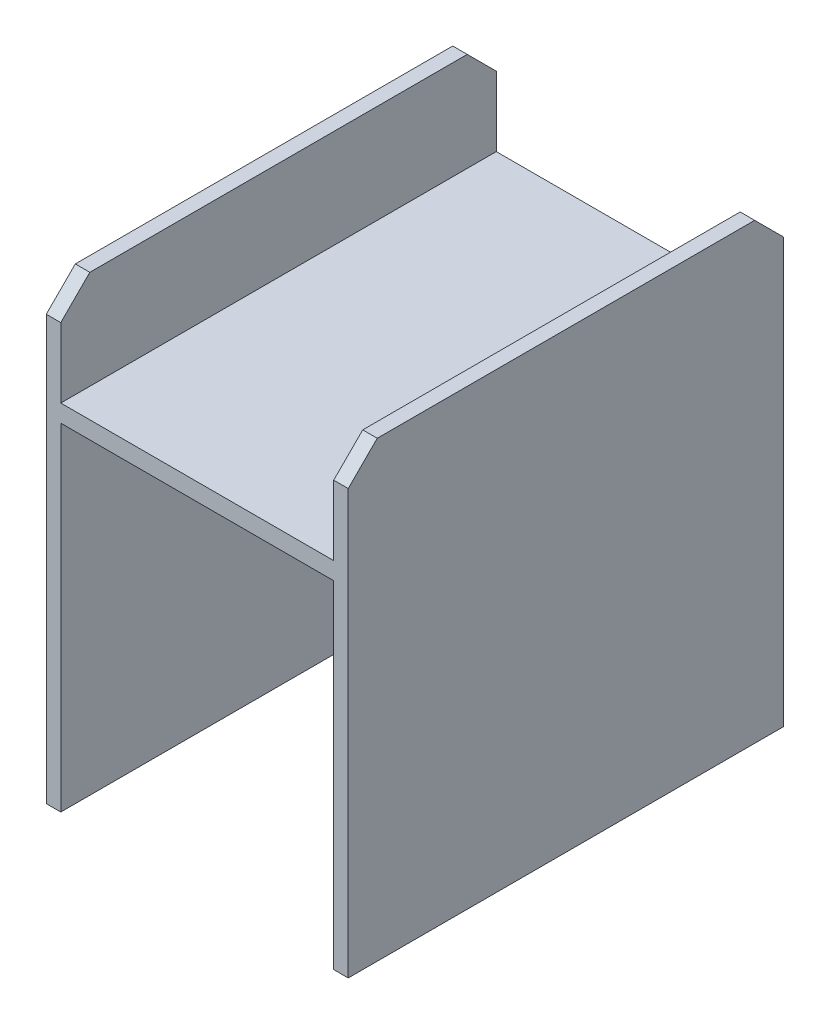
ISO-10303-21;
HEADER;
FILE_DESCRIPTION(('STEP AP214'),'2;1');
FILE_NAME('part.step','',(''),(''),'','','');
FILE_SCHEMA(('AUTOMOTIVE_DESIGN { 1 0 10303 214 1 1 1 1 }'));
ENDSEC;
DATA;
#1=APPLICATION_CONTEXT('core data for automotive mechanical design processes');
#2=APPLICATION_PROTOCOL_DEFINITION('international standard','automotive_design',2000,#1);
#3=PRODUCT_CONTEXT('',#1,'mechanical');
#4=PRODUCT('Part','Part','',(#3));
#5=PRODUCT_RELATED_PRODUCT_CATEGORY('part','',(#4));
#6=PRODUCT_DEFINITION_FORMATION('','',#4);
#7=PRODUCT_DEFINITION_CONTEXT('part definition',#1,'design');
#8=PRODUCT_DEFINITION('design','',#6,#7);
#9=PRODUCT_DEFINITION_SHAPE('','',#8);
#10=(LENGTH_UNIT() NAMED_UNIT(*) SI_UNIT(.MILLI.,.METRE.));
#11=(NAMED_UNIT(*) PLANE_ANGLE_UNIT() SI_UNIT($,.RADIAN.));
#12=(NAMED_UNIT(*) SI_UNIT($,.STERADIAN.) SOLID_ANGLE_UNIT());
#13=UNCERTAINTY_MEASURE_WITH_UNIT(LENGTH_MEASURE(1.E-05),#10,'distance_accuracy_value','');
#14=(GEOMETRIC_REPRESENTATION_CONTEXT(3) GLOBAL_UNCERTAINTY_ASSIGNED_CONTEXT((#13)) GLOBAL_UNIT_ASSIGNED_CONTEXT((#10,
#11,#12)) REPRESENTATION_CONTEXT('',''));
#15=CARTESIAN_POINT('',(0.,0.,0.));
#16=DIRECTION('',(0.,0.,1.));
#17=DIRECTION('',(1.,0.,0.));
#18=AXIS2_PLACEMENT_3D('',#15,#16,#17);
#19=CARTESIAN_POINT('',(16.4473684210526,-37.,-32.4561403508772));
#20=DIRECTION('',(-1.,0.,0.));
#21=DIRECTION('',(0.,0.,1.));
#22=AXIS2_PLACEMENT_3D('',#19,#20,#21);
#23=PLANE('',#22);
#24=DIRECTION('',(0.,0.,1.));
#25=VECTOR('',#24,1.);
#26=CARTESIAN_POINT('',(16.4473684210526,41.,-32.4561403508772));
#27=LINE('',#26,#25);
#28=CARTESIAN_POINT('',(16.4473684210526,41.,-27.4561403508772));
#29=VERTEX_POINT('',#28);
#30=CARTESIAN_POINT('',(16.4473684210526,41.,37.5438596491227));
#31=VERTEX_POINT('',#30);
#32=EDGE_CURVE('E257',#29,#31,#27,.T.);
#33=ORIENTED_EDGE('',*,*,#32,.F.);
#34=DIRECTION('',(0.,0.707106781186549,0.707106781186547));
#35=VECTOR('',#34,1.);
#36=CARTESIAN_POINT('',(16.4473684210526,-0.500000000000105,-68.9561403508772));
#37=LINE('',#36,#35);
#38=CARTESIAN_POINT('',(16.4473684210526,36.,-32.4561403508772));
#39=VERTEX_POINT('',#38);
#40=EDGE_CURVE('E312',#29,#39,#37,.F.);
#41=ORIENTED_EDGE('',*,*,#40,.T.);
#42=DIRECTION('',(0.,1.,0.));
#43=VECTOR('',#42,1.);
#44=CARTESIAN_POINT('',(16.4473684210526,-37.,-32.4561403508772));
#45=LINE('',#44,#43);
#46=CARTESIAN_POINT('',(16.4473684210526,24.,-32.4561403508772));
#47=VERTEX_POINT('',#46);
#48=EDGE_CURVE('E237',#47,#39,#45,.T.);
#49=ORIENTED_EDGE('',*,*,#48,.F.);
#50=DIRECTION('',(0.,0.,-1.));
#51=VECTOR('',#50,1.);
#52=CARTESIAN_POINT('',(16.4473684210526,24.,42.5438596491228));
#53=LINE('',#52,#51);
#54=CARTESIAN_POINT('',(16.4473684210526,24.,42.5438596491228));
#55=VERTEX_POINT('',#54);
#56=EDGE_CURVE('E183',#55,#47,#53,.T.);
#57=ORIENTED_EDGE('',*,*,#56,.F.);
#58=DIRECTION('',(0.,1.,0.));
#59=VECTOR('',#58,1.);
#60=CARTESIAN_POINT('',(16.4473684210526,-37.,42.5438596491228));
#61=LINE('',#60,#59);
#62=CARTESIAN_POINT('',(16.4473684210526,36.,42.5438596491228));
#63=VERTEX_POINT('',#62);
#64=EDGE_CURVE('E241',#55,#63,#61,.T.);
#65=ORIENTED_EDGE('',*,*,#64,.T.);
#66=DIRECTION('',(0.,-0.707106781186549,0.707106781186546));
#67=VECTOR('',#66,1.);
#68=CARTESIAN_POINT('',(16.4473684210526,36.9999999999998,41.543859649123));
#69=LINE('',#68,#67);
#70=EDGE_CURVE('E309',#63,#31,#69,.F.);
#71=ORIENTED_EDGE('',*,*,#70,.T.);
#72=EDGE_LOOP('',(#33,#41,#49,#57,#65,#71));
#73=FACE_BOUND('',#72,.T.);
#74=ADVANCED_FACE('F47',(#73),#23,.T.);
#75=CARTESIAN_POINT('',(-30.5526315789474,-37.,-32.4561403508772));
#76=DIRECTION('',(1.,0.,0.));
#77=DIRECTION('',(0.,0.,-1.));
#78=AXIS2_PLACEMENT_3D('',#75,#76,#77);
#79=PLANE('',#78);
#80=DIRECTION('',(0.,1.,0.));
#81=VECTOR('',#80,1.);
#82=CARTESIAN_POINT('',(-30.5526315789474,-37.,-32.4561403508772));
#83=LINE('',#82,#81);
#84=CARTESIAN_POINT('',(-30.5526315789474,24.,-32.4561403508772));
#85=VERTEX_POINT('',#84);
#86=CARTESIAN_POINT('',(-30.5526315789474,36.,-32.4561403508772));
#87=VERTEX_POINT('',#86);
#88=EDGE_CURVE('E172',#85,#87,#83,.T.);
#89=ORIENTED_EDGE('',*,*,#88,.T.);
#90=DIRECTION('',(0.,0.707106781186549,0.707106781186547));
#91=VECTOR('',#90,1.);
#92=CARTESIAN_POINT('',(-30.5526315789474,-0.500000000000105,-68.9561403508772));
#93=LINE('',#92,#91);
#94=CARTESIAN_POINT('',(-30.5526315789474,41.,-27.4561403508772));
#95=VERTEX_POINT('',#94);
#96=EDGE_CURVE('E298',#87,#95,#93,.T.);
#97=ORIENTED_EDGE('',*,*,#96,.T.);
#98=DIRECTION('',(0.,0.,-1.));
#99=VECTOR('',#98,1.);
#100=CARTESIAN_POINT('',(-30.5526315789474,41.,-32.4561403508772));
#101=LINE('',#100,#99);
#102=CARTESIAN_POINT('',(-30.5526315789474,41.,37.5438596491227));
#103=VERTEX_POINT('',#102);
#104=EDGE_CURVE('E212',#103,#95,#101,.T.);
#105=ORIENTED_EDGE('',*,*,#104,.F.);
#106=DIRECTION('',(0.,-0.707106781186549,0.707106781186546));
#107=VECTOR('',#106,1.);
#108=CARTESIAN_POINT('',(-30.5526315789474,36.9999999999998,41.543859649123));
#109=LINE('',#108,#107);
#110=CARTESIAN_POINT('',(-30.5526315789474,36.,42.5438596491228));
#111=VERTEX_POINT('',#110);
#112=EDGE_CURVE('E295',#103,#111,#109,.T.);
#113=ORIENTED_EDGE('',*,*,#112,.T.);
#114=DIRECTION('',(0.,1.,0.));
#115=VECTOR('',#114,1.);
#116=CARTESIAN_POINT('',(-30.5526315789474,-37.,42.5438596491228));
#117=LINE('',#116,#115);
#118=CARTESIAN_POINT('',(-30.5526315789474,24.,42.5438596491228));
#119=VERTEX_POINT('',#118);
#120=EDGE_CURVE('E173',#119,#111,#117,.T.);
#121=ORIENTED_EDGE('',*,*,#120,.F.);
#122=DIRECTION('',(0.,0.,1.));
#123=VECTOR('',#122,1.);
#124=CARTESIAN_POINT('',(-30.5526315789474,24.,42.5438596491228));
#125=LINE('',#124,#123);
#126=EDGE_CURVE('E190',#85,#119,#125,.T.);
#127=ORIENTED_EDGE('',*,*,#126,.F.);
#128=EDGE_LOOP('',(#89,#97,#105,#113,#121,#127));
#129=FACE_BOUND('',#128,.T.);
#130=ADVANCED_FACE('F354',(#129),#79,.T.);
#131=CARTESIAN_POINT('',(-33.0526315789474,3.,-32.4561403508772));
#132=DIRECTION('',(1.,0.,0.));
#133=DIRECTION('',(0.,0.,-1.));
#134=AXIS2_PLACEMENT_3D('',#131,#132,#133);
#135=PLANE('',#134);
#136=DIRECTION('',(0.,0.,1.));
#137=VECTOR('',#136,1.);
#138=CARTESIAN_POINT('',(-33.0526315789474,41.,-32.4561403508772));
#139=LINE('',#138,#137);
#140=CARTESIAN_POINT('',(-33.0526315789474,41.,-27.4561403508772));
#141=VERTEX_POINT('',#140);
#142=CARTESIAN_POINT('',(-33.0526315789474,41.,37.5438596491227));
#143=VERTEX_POINT('',#142);
#144=EDGE_CURVE('E208',#141,#143,#139,.T.);
#145=ORIENTED_EDGE('',*,*,#144,.F.);
#146=DIRECTION('',(0.,-0.707106781186549,-0.707106781186547));
#147=VECTOR('',#146,1.);
#148=CARTESIAN_POINT('',(-33.0526315789474,41.,-27.4561403508772));
#149=LINE('',#148,#147);
#150=CARTESIAN_POINT('',(-33.0526315789474,36.,-32.4561403508772));
#151=VERTEX_POINT('',#150);
#152=EDGE_CURVE('E286',#141,#151,#149,.T.);
#153=ORIENTED_EDGE('',*,*,#152,.T.);
#154=DIRECTION('',(0.,-1.,0.));
#155=VECTOR('',#154,1.);
#156=CARTESIAN_POINT('',(-33.0526315789474,3.,-32.4561403508772));
#157=LINE('',#156,#155);
#158=CARTESIAN_POINT('',(-33.0526315789474,-37.,-32.4561403508772));
#159=VERTEX_POINT('',#158);
#160=EDGE_CURVE('E231',#151,#159,#157,.T.);
#161=ORIENTED_EDGE('',*,*,#160,.T.);
#162=DIRECTION('',(0.,0.,1.));
#163=VECTOR('',#162,1.);
#164=CARTESIAN_POINT('',(-33.0526315789474,-37.,-32.4561403508772));
#165=LINE('',#164,#163);
#166=CARTESIAN_POINT('',(-33.0526315789474,-37.,42.5438596491228));
#167=VERTEX_POINT('',#166);
#168=EDGE_CURVE('E217',#159,#167,#165,.T.);
#169=ORIENTED_EDGE('',*,*,#168,.T.);
#170=DIRECTION('',(0.,-1.,0.));
#171=VECTOR('',#170,1.);
#172=CARTESIAN_POINT('',(-33.0526315789474,3.,42.5438596491228));
#173=LINE('',#172,#171);
#174=CARTESIAN_POINT('',(-33.0526315789474,36.,42.5438596491228));
#175=VERTEX_POINT('',#174);
#176=EDGE_CURVE('E272',#175,#167,#173,.T.);
#177=ORIENTED_EDGE('',*,*,#176,.F.);
#178=DIRECTION('',(0.,0.707106781186549,-0.707106781186546));
#179=VECTOR('',#178,1.);
#180=CARTESIAN_POINT('',(-33.0526315789474,41.,37.5438596491227));
#181=LINE('',#180,#179);
#182=EDGE_CURVE('E283',#175,#143,#181,.T.);
#183=ORIENTED_EDGE('',*,*,#182,.T.);
#184=EDGE_LOOP('',(#145,#153,#161,#169,#177,#183));
#185=FACE_BOUND('',#184,.T.);
#186=ADVANCED_FACE('F365',(#185),#135,.F.);
#187=CARTESIAN_POINT('',(-33.0526315789474,3.,42.5438596491228));
#188=DIRECTION('',(0.,0.,-1.));
#189=DIRECTION('',(-1.,0.,0.));
#190=AXIS2_PLACEMENT_3D('',#187,#188,#189);
#191=PLANE('',#190);
#192=ORIENTED_EDGE('',*,*,#120,.T.);
#193=DIRECTION('',(-1.,0.,0.));
#194=VECTOR('',#193,1.);
#195=CARTESIAN_POINT('',(-33.0526315789474,36.,42.5438596491228));
#196=LINE('',#195,#194);
#197=EDGE_CURVE('E11',#111,#175,#196,.T.);
#198=ORIENTED_EDGE('',*,*,#197,.T.);
#199=ORIENTED_EDGE('',*,*,#176,.T.);
#200=DIRECTION('',(1.,0.,0.));
#201=VECTOR('',#200,1.);
#202=CARTESIAN_POINT('',(-33.0526315789474,-37.,42.5438596491228));
#203=LINE('',#202,#201);
#204=CARTESIAN_POINT('',(-30.5526315789474,-37.,42.5438596491228));
#205=VERTEX_POINT('',#204);
#206=EDGE_CURVE('E166',#167,#205,#203,.T.);
#207=ORIENTED_EDGE('',*,*,#206,.T.);
#208=CARTESIAN_POINT('',(-30.5526315789474,21.,42.5438596491228));
#209=VERTEX_POINT('',#208);
#210=EDGE_CURVE('E159',#205,#209,#117,.T.);
#211=ORIENTED_EDGE('',*,*,#210,.T.);
#212=DIRECTION('',(-1.,0.,0.));
#213=VECTOR('',#212,1.);
#214=CARTESIAN_POINT('',(91.5073444402334,21.,42.5438596491228));
#215=LINE('',#214,#213);
#216=CARTESIAN_POINT('',(16.4473684210526,21.,42.5438596491228));
#217=VERTEX_POINT('',#216);
#218=EDGE_CURVE('E163',#217,#209,#215,.T.);
#219=ORIENTED_EDGE('',*,*,#218,.F.);
#220=CARTESIAN_POINT('',(16.4473684210526,-37.,42.5438596491228));
#221=VERTEX_POINT('',#220);
#222=EDGE_CURVE('E238',#221,#217,#61,.T.);
#223=ORIENTED_EDGE('',*,*,#222,.F.);
#224=DIRECTION('',(1.,0.,0.));
#225=VECTOR('',#224,1.);
#226=CARTESIAN_POINT('',(18.9473684210526,-37.,42.5438596491228));
#227=LINE('',#226,#225);
#228=CARTESIAN_POINT('',(18.9473684210526,-37.,42.5438596491228));
#229=VERTEX_POINT('',#228);
#230=EDGE_CURVE('E236',#221,#229,#227,.T.);
#231=ORIENTED_EDGE('',*,*,#230,.T.);
#232=DIRECTION('',(0.,-1.,0.));
#233=VECTOR('',#232,1.);
#234=CARTESIAN_POINT('',(18.9473684210526,3.,42.5438596491228));
#235=LINE('',#234,#233);
#236=CARTESIAN_POINT('',(18.9473684210526,36.,42.5438596491228));
#237=VERTEX_POINT('',#236);
#238=EDGE_CURVE('E269',#237,#229,#235,.T.);
#239=ORIENTED_EDGE('',*,*,#238,.F.);
#240=DIRECTION('',(-1.,0.,0.));
#241=VECTOR('',#240,1.);
#242=CARTESIAN_POINT('',(-33.0526315789474,36.,42.5438596491228));
#243=LINE('',#242,#241);
#244=EDGE_CURVE('E57',#237,#63,#243,.T.);
#245=ORIENTED_EDGE('',*,*,#244,.T.);
#246=ORIENTED_EDGE('',*,*,#64,.F.);
#247=DIRECTION('',(-1.,0.,0.));
#248=VECTOR('',#247,1.);
#249=CARTESIAN_POINT('',(91.5073444402334,24.,42.5438596491228));
#250=LINE('',#249,#248);
#251=EDGE_CURVE('E193',#55,#119,#250,.T.);
#252=ORIENTED_EDGE('',*,*,#251,.T.);
#253=EDGE_LOOP('',(#192,#198,#199,#207,#211,#219,#223,#231,#239,#245,#246,#252));
#254=FACE_BOUND('',#253,.T.);
#255=ADVANCED_FACE('F162',(#254),#191,.F.);
#256=CARTESIAN_POINT('',(18.9473684210526,3.,-32.4561403508772));
#257=DIRECTION('',(-1.,0.,0.));
#258=DIRECTION('',(0.,0.,1.));
#259=AXIS2_PLACEMENT_3D('',#256,#257,#258);
#260=PLANE('',#259);
#261=DIRECTION('',(0.,-1.,0.));
#262=VECTOR('',#261,1.);
#263=CARTESIAN_POINT('',(18.9473684210526,3.,-32.4561403508772));
#264=LINE('',#263,#262);
#265=CARTESIAN_POINT('',(18.9473684210526,36.,-32.4561403508772));
#266=VERTEX_POINT('',#265);
#267=CARTESIAN_POINT('',(18.9473684210526,-37.,-32.4561403508772));
#268=VERTEX_POINT('',#267);
#269=EDGE_CURVE('E266',#266,#268,#264,.T.);
#270=ORIENTED_EDGE('',*,*,#269,.F.);
#271=DIRECTION('',(0.,-0.707106781186549,-0.707106781186547));
#272=VECTOR('',#271,1.);
#273=CARTESIAN_POINT('',(18.9473684210526,41.,-27.4561403508772));
#274=LINE('',#273,#272);
#275=CARTESIAN_POINT('',(18.9473684210526,41.,-27.4561403508772));
#276=VERTEX_POINT('',#275);
#277=EDGE_CURVE('E317',#266,#276,#274,.F.);
#278=ORIENTED_EDGE('',*,*,#277,.T.);
#279=DIRECTION('',(0.,0.,-1.));
#280=VECTOR('',#279,1.);
#281=CARTESIAN_POINT('',(18.9473684210526,41.,-32.4561403508772));
#282=LINE('',#281,#280);
#283=CARTESIAN_POINT('',(18.9473684210526,41.,37.5438596491227));
#284=VERTEX_POINT('',#283);
#285=EDGE_CURVE('E213',#284,#276,#282,.T.);
#286=ORIENTED_EDGE('',*,*,#285,.F.);
#287=DIRECTION('',(0.,0.707106781186549,-0.707106781186546));
#288=VECTOR('',#287,1.);
#289=CARTESIAN_POINT('',(18.9473684210526,41.,37.5438596491227));
#290=LINE('',#289,#288);
#291=EDGE_CURVE('E64',#284,#237,#290,.F.);
#292=ORIENTED_EDGE('',*,*,#291,.T.);
#293=ORIENTED_EDGE('',*,*,#238,.T.);
#294=DIRECTION('',(0.,0.,-1.));
#295=VECTOR('',#294,1.);
#296=CARTESIAN_POINT('',(18.9473684210526,-37.,-32.4561403508772));
#297=LINE('',#296,#295);
#298=EDGE_CURVE('E253',#229,#268,#297,.T.);
#299=ORIENTED_EDGE('',*,*,#298,.T.);
#300=EDGE_LOOP('',(#270,#278,#286,#292,#293,#299));
#301=FACE_BOUND('',#300,.T.);
#302=ADVANCED_FACE('F338',(#301),#260,.F.);
#303=CARTESIAN_POINT('',(-33.0526315789474,3.,-32.4561403508772));
#304=DIRECTION('',(0.,0.,1.));
#305=DIRECTION('',(1.,0.,0.));
#306=AXIS2_PLACEMENT_3D('',#303,#304,#305);
#307=PLANE('',#306);
#308=ORIENTED_EDGE('',*,*,#160,.F.);
#309=DIRECTION('',(1.,0.,0.));
#310=VECTOR('',#309,1.);
#311=CARTESIAN_POINT('',(-30.5526315789474,36.,-32.4561403508772));
#312=LINE('',#311,#310);
#313=EDGE_CURVE('E292',#151,#87,#312,.T.);
#314=ORIENTED_EDGE('',*,*,#313,.T.);
#315=ORIENTED_EDGE('',*,*,#88,.F.);
#316=DIRECTION('',(-1.,0.,0.));
#317=VECTOR('',#316,1.);
#318=CARTESIAN_POINT('',(91.5073444402334,24.,-32.4561403508772));
#319=LINE('',#318,#317);
#320=EDGE_CURVE('E200',#47,#85,#319,.T.);
#321=ORIENTED_EDGE('',*,*,#320,.F.);
#322=ORIENTED_EDGE('',*,*,#48,.T.);
#323=DIRECTION('',(1.,0.,0.));
#324=VECTOR('',#323,1.);
#325=CARTESIAN_POINT('',(-33.0526315789474,36.,-32.4561403508772));
#326=LINE('',#325,#324);
#327=EDGE_CURVE('E289',#39,#266,#326,.T.);
#328=ORIENTED_EDGE('',*,*,#327,.T.);
#329=ORIENTED_EDGE('',*,*,#269,.T.);
#330=DIRECTION('',(-1.,0.,0.));
#331=VECTOR('',#330,1.);
#332=CARTESIAN_POINT('',(18.9473684210526,-37.,-32.4561403508772));
#333=LINE('',#332,#331);
#334=CARTESIAN_POINT('',(16.4473684210526,-37.,-32.4561403508772));
#335=VERTEX_POINT('',#334);
#336=EDGE_CURVE('E249',#268,#335,#333,.T.);
#337=ORIENTED_EDGE('',*,*,#336,.T.);
#338=CARTESIAN_POINT('',(16.4473684210526,21.,-32.4561403508772));
#339=VERTEX_POINT('',#338);
#340=EDGE_CURVE('E233',#335,#339,#45,.T.);
#341=ORIENTED_EDGE('',*,*,#340,.T.);
#342=DIRECTION('',(-1.,0.,0.));
#343=VECTOR('',#342,1.);
#344=CARTESIAN_POINT('',(91.5073444402334,21.,-32.4561403508772));
#345=LINE('',#344,#343);
#346=CARTESIAN_POINT('',(-30.5526315789474,21.,-32.4561403508772));
#347=VERTEX_POINT('',#346);
#348=EDGE_CURVE('E184',#339,#347,#345,.T.);
#349=ORIENTED_EDGE('',*,*,#348,.T.);
#350=CARTESIAN_POINT('',(-30.5526315789474,-37.,-32.4561403508772));
#351=VERTEX_POINT('',#350);
#352=EDGE_CURVE('E187',#351,#347,#83,.T.);
#353=ORIENTED_EDGE('',*,*,#352,.F.);
#354=DIRECTION('',(-1.,0.,0.));
#355=VECTOR('',#354,1.);
#356=CARTESIAN_POINT('',(-33.0526315789474,-37.,-32.4561403508772));
#357=LINE('',#356,#355);
#358=EDGE_CURVE('E226',#351,#159,#357,.T.);
#359=ORIENTED_EDGE('',*,*,#358,.T.);
#360=EDGE_LOOP('',(#308,#314,#315,#321,#322,#328,#329,#337,#341,#349,#353,#359));
#361=FACE_BOUND('',#360,.T.);
#362=ADVANCED_FACE('F346',(#361),#307,.F.);
#363=CARTESIAN_POINT('',(0.,-37.,0.));
#364=DIRECTION('',(0.,-1.,0.));
#365=DIRECTION('',(0.,0.,-1.));
#366=AXIS2_PLACEMENT_3D('',#363,#364,#365);
#367=PLANE('',#366);
#368=ORIENTED_EDGE('',*,*,#298,.F.);
#369=ORIENTED_EDGE('',*,*,#230,.F.);
#370=DIRECTION('',(0.,0.,1.));
#371=VECTOR('',#370,1.);
#372=CARTESIAN_POINT('',(16.4473684210526,-37.,-32.4561403508772));
#373=LINE('',#372,#371);
#374=EDGE_CURVE('E245',#335,#221,#373,.T.);
#375=ORIENTED_EDGE('',*,*,#374,.F.);
#376=ORIENTED_EDGE('',*,*,#336,.F.);
#377=EDGE_LOOP('',(#368,#369,#375,#376));
#378=FACE_BOUND('',#377,.T.);
#379=ADVANCED_FACE('F379',(#378),#367,.T.);
#380=ORIENTED_EDGE('',*,*,#222,.T.);
#381=DIRECTION('',(0.,0.,1.));
#382=VECTOR('',#381,1.);
#383=CARTESIAN_POINT('',(16.4473684210526,21.,42.5438596491228));
#384=LINE('',#383,#382);
#385=EDGE_CURVE('E181',#339,#217,#384,.T.);
#386=ORIENTED_EDGE('',*,*,#385,.F.);
#387=ORIENTED_EDGE('',*,*,#340,.F.);
#388=ORIENTED_EDGE('',*,*,#374,.T.);
#389=EDGE_LOOP('',(#380,#386,#387,#388));
#390=FACE_BOUND('',#389,.T.);
#391=ADVANCED_FACE('F375',(#390),#23,.T.);
#392=CARTESIAN_POINT('',(0.,-37.,0.));
#393=DIRECTION('',(0.,1.,0.));
#394=DIRECTION('',(0.,0.,1.));
#395=AXIS2_PLACEMENT_3D('',#392,#393,#394);
#396=PLANE('',#395);
#397=ORIENTED_EDGE('',*,*,#168,.F.);
#398=ORIENTED_EDGE('',*,*,#358,.F.);
#399=DIRECTION('',(0.,0.,-1.));
#400=VECTOR('',#399,1.);
#401=CARTESIAN_POINT('',(-30.5526315789474,-37.,-32.4561403508772));
#402=LINE('',#401,#400);
#403=EDGE_CURVE('E223',#205,#351,#402,.T.);
#404=ORIENTED_EDGE('',*,*,#403,.F.);
#405=ORIENTED_EDGE('',*,*,#206,.F.);
#406=EDGE_LOOP('',(#397,#398,#404,#405));
#407=FACE_BOUND('',#406,.T.);
#408=ADVANCED_FACE('F369',(#407),#396,.F.);
#409=ORIENTED_EDGE('',*,*,#352,.T.);
#410=DIRECTION('',(0.,0.,-1.));
#411=VECTOR('',#410,1.);
#412=CARTESIAN_POINT('',(-30.5526315789474,21.,42.5438596491228));
#413=LINE('',#412,#411);
#414=EDGE_CURVE('E179',#209,#347,#413,.T.);
#415=ORIENTED_EDGE('',*,*,#414,.F.);
#416=ORIENTED_EDGE('',*,*,#210,.F.);
#417=ORIENTED_EDGE('',*,*,#403,.T.);
#418=EDGE_LOOP('',(#409,#415,#416,#417));
#419=FACE_BOUND('',#418,.T.);
#420=ADVANCED_FACE('F186',(#419),#79,.T.);
#421=CARTESIAN_POINT('',(0.,41.,0.));
#422=DIRECTION('',(0.,-1.,0.));
#423=DIRECTION('',(0.,0.,-1.));
#424=AXIS2_PLACEMENT_3D('',#421,#422,#423);
#425=PLANE('',#424);
#426=ORIENTED_EDGE('',*,*,#285,.T.);
#427=DIRECTION('',(-1.,0.,0.));
#428=VECTOR('',#427,1.);
#429=CARTESIAN_POINT('',(0.,41.,-27.4561403508772));
#430=LINE('',#429,#428);
#431=EDGE_CURVE('E305',#276,#29,#430,.T.);
#432=ORIENTED_EDGE('',*,*,#431,.T.);
#433=ORIENTED_EDGE('',*,*,#32,.T.);
#434=DIRECTION('',(1.,0.,0.));
#435=VECTOR('',#434,1.);
#436=CARTESIAN_POINT('',(0.,41.,37.5438596491227));
#437=LINE('',#436,#435);
#438=EDGE_CURVE('E301',#31,#284,#437,.T.);
#439=ORIENTED_EDGE('',*,*,#438,.T.);
#440=EDGE_LOOP('',(#426,#432,#433,#439));
#441=FACE_BOUND('',#440,.T.);
#442=ADVANCED_FACE('F335',(#441),#425,.F.);
#443=CARTESIAN_POINT('',(0.,41.,0.));
#444=DIRECTION('',(0.,1.,0.));
#445=DIRECTION('',(0.,0.,1.));
#446=AXIS2_PLACEMENT_3D('',#443,#444,#445);
#447=PLANE('',#446);
#448=ORIENTED_EDGE('',*,*,#104,.T.);
#449=DIRECTION('',(-1.,0.,0.));
#450=VECTOR('',#449,1.);
#451=CARTESIAN_POINT('',(-33.0526315789474,41.,-27.4561403508772));
#452=LINE('',#451,#450);
#453=EDGE_CURVE('E279',#95,#141,#452,.T.);
#454=ORIENTED_EDGE('',*,*,#453,.T.);
#455=ORIENTED_EDGE('',*,*,#144,.T.);
#456=DIRECTION('',(1.,0.,0.));
#457=VECTOR('',#456,1.);
#458=CARTESIAN_POINT('',(-30.5526315789474,41.,37.5438596491227));
#459=LINE('',#458,#457);
#460=EDGE_CURVE('E275',#143,#103,#459,.T.);
#461=ORIENTED_EDGE('',*,*,#460,.T.);
#462=EDGE_LOOP('',(#448,#454,#455,#461));
#463=FACE_BOUND('',#462,.T.);
#464=ADVANCED_FACE('F361',(#463),#447,.T.);
#465=CARTESIAN_POINT('',(91.5073444402334,24.,42.5438596491228));
#466=DIRECTION('',(0.,-1.,0.));
#467=DIRECTION('',(0.,0.,-1.));
#468=AXIS2_PLACEMENT_3D('',#465,#466,#467);
#469=PLANE('',#468);
#470=ORIENTED_EDGE('',*,*,#251,.F.);
#471=ORIENTED_EDGE('',*,*,#56,.T.);
#472=ORIENTED_EDGE('',*,*,#320,.T.);
#473=ORIENTED_EDGE('',*,*,#126,.T.);
#474=EDGE_LOOP('',(#470,#471,#472,#473));
#475=FACE_BOUND('',#474,.T.);
#476=ADVANCED_FACE('F350',(#475),#469,.F.);
#477=CARTESIAN_POINT('',(91.5073444402334,21.,42.5438596491228));
#478=DIRECTION('',(0.,1.,0.));
#479=DIRECTION('',(0.,0.,1.));
#480=AXIS2_PLACEMENT_3D('',#477,#478,#479);
#481=PLANE('',#480);
#482=ORIENTED_EDGE('',*,*,#348,.F.);
#483=ORIENTED_EDGE('',*,*,#385,.T.);
#484=ORIENTED_EDGE('',*,*,#218,.T.);
#485=ORIENTED_EDGE('',*,*,#414,.T.);
#486=EDGE_LOOP('',(#482,#483,#484,#485));
#487=FACE_BOUND('',#486,.T.);
#488=ADVANCED_FACE('F178',(#487),#481,.F.);
#489=CARTESIAN_POINT('',(0.,41.,-27.4561403508772));
#490=DIRECTION('',(0.,0.707106781186546,-0.707106781186548));
#491=DIRECTION('',(1.,0.,0.));
#492=AXIS2_PLACEMENT_3D('',#489,#490,#491);
#493=PLANE('',#492);
#494=ORIENTED_EDGE('',*,*,#96,.F.);
#495=ORIENTED_EDGE('',*,*,#313,.F.);
#496=ORIENTED_EDGE('',*,*,#152,.F.);
#497=ORIENTED_EDGE('',*,*,#453,.F.);
#498=EDGE_LOOP('',(#494,#495,#496,#497));
#499=FACE_BOUND('',#498,.T.);
#500=ADVANCED_FACE('F402',(#499),#493,.T.);
#501=CARTESIAN_POINT('',(0.,41.,-27.4561403508772));
#502=DIRECTION('',(0.,-0.707106781186546,0.707106781186548));
#503=DIRECTION('',(-1.,0.,0.));
#504=AXIS2_PLACEMENT_3D('',#501,#502,#503);
#505=PLANE('',#504);
#506=ORIENTED_EDGE('',*,*,#277,.F.);
#507=ORIENTED_EDGE('',*,*,#327,.F.);
#508=ORIENTED_EDGE('',*,*,#40,.F.);
#509=ORIENTED_EDGE('',*,*,#431,.F.);
#510=EDGE_LOOP('',(#506,#507,#508,#509));
#511=FACE_BOUND('',#510,.T.);
#512=ADVANCED_FACE('F342',(#511),#505,.F.);
#513=CARTESIAN_POINT('',(0.,41.,37.5438596491227));
#514=DIRECTION('',(0.,0.707106781186545,0.707106781186549));
#515=DIRECTION('',(-1.,0.,0.));
#516=AXIS2_PLACEMENT_3D('',#513,#514,#515);
#517=PLANE('',#516);
#518=ORIENTED_EDGE('',*,*,#182,.F.);
#519=ORIENTED_EDGE('',*,*,#197,.F.);
#520=ORIENTED_EDGE('',*,*,#112,.F.);
#521=ORIENTED_EDGE('',*,*,#460,.F.);
#522=EDGE_LOOP('',(#518,#519,#520,#521));
#523=FACE_BOUND('',#522,.T.);
#524=ADVANCED_FACE('F359',(#523),#517,.T.);
#525=CARTESIAN_POINT('',(0.,41.,37.5438596491227));
#526=DIRECTION('',(0.,-0.707106781186545,-0.707106781186549));
#527=DIRECTION('',(1.,0.,0.));
#528=AXIS2_PLACEMENT_3D('',#525,#526,#527);
#529=PLANE('',#528);
#530=ORIENTED_EDGE('',*,*,#70,.F.);
#531=ORIENTED_EDGE('',*,*,#244,.F.);
#532=ORIENTED_EDGE('',*,*,#291,.F.);
#533=ORIENTED_EDGE('',*,*,#438,.F.);
#534=EDGE_LOOP('',(#530,#531,#532,#533));
#535=FACE_BOUND('',#534,.T.);
#536=ADVANCED_FACE('F50',(#535),#529,.F.);
#537=CLOSED_SHELL('',(#74,#130,#186,#255,#302,#362,#379,#391,#408,#420,#442,#464,#476,#488,#500,
#512,#524,#536));
#538=MANIFOLD_SOLID_BREP('B2',#537);
#539=ADVANCED_BREP_SHAPE_REPRESENTATION('',(#18,#538),#14);
#540=SHAPE_DEFINITION_REPRESENTATION(#9,#539);
ENDSEC;
END-ISO-10303-21;
